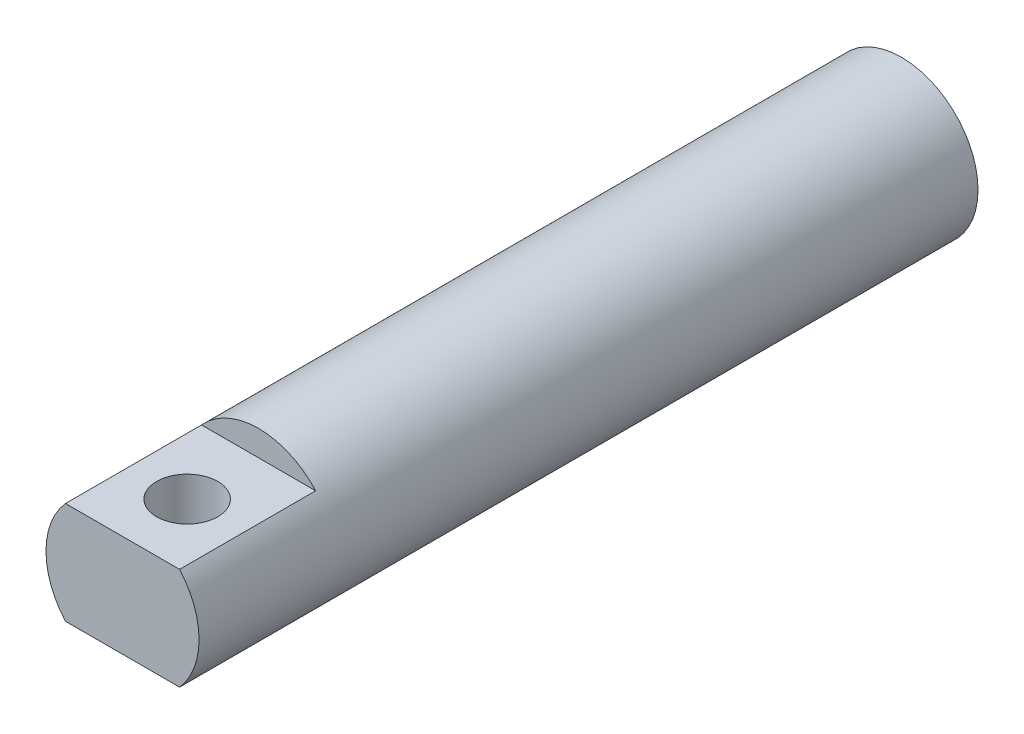
ISO-10303-21;
HEADER;
FILE_DESCRIPTION(('STEP AP214'),'2;1');
FILE_NAME('part.step','',(''),(''),'','','');
FILE_SCHEMA(('AUTOMOTIVE_DESIGN { 1 0 10303 214 1 1 1 1 }'));
ENDSEC;
DATA;
#1=APPLICATION_CONTEXT('core data for automotive mechanical design processes');
#2=APPLICATION_PROTOCOL_DEFINITION('international standard','automotive_design',2000,#1);
#3=PRODUCT_CONTEXT('',#1,'mechanical');
#4=PRODUCT('Part','Part','',(#3));
#5=PRODUCT_RELATED_PRODUCT_CATEGORY('part','',(#4));
#6=PRODUCT_DEFINITION_FORMATION('','',#4);
#7=PRODUCT_DEFINITION_CONTEXT('part definition',#1,'design');
#8=PRODUCT_DEFINITION('design','',#6,#7);
#9=PRODUCT_DEFINITION_SHAPE('','',#8);
#10=(LENGTH_UNIT() NAMED_UNIT(*) SI_UNIT(.MILLI.,.METRE.));
#11=(NAMED_UNIT(*) PLANE_ANGLE_UNIT() SI_UNIT($,.RADIAN.));
#12=(NAMED_UNIT(*) SI_UNIT($,.STERADIAN.) SOLID_ANGLE_UNIT());
#13=UNCERTAINTY_MEASURE_WITH_UNIT(LENGTH_MEASURE(1.E-05),#10,'distance_accuracy_value','');
#14=(GEOMETRIC_REPRESENTATION_CONTEXT(3) GLOBAL_UNCERTAINTY_ASSIGNED_CONTEXT((#13)) GLOBAL_UNIT_ASSIGNED_CONTEXT((#10,
#11,#12)) REPRESENTATION_CONTEXT('',''));
#15=CARTESIAN_POINT('',(0.,0.,0.));
#16=DIRECTION('',(0.,0.,1.));
#17=DIRECTION('',(1.,0.,0.));
#18=AXIS2_PLACEMENT_3D('',#15,#16,#17);
#19=CARTESIAN_POINT('',(0.,0.,37.8));
#20=DIRECTION('',(0.,0.,1.));
#21=DIRECTION('',(1.,0.,0.));
#22=AXIS2_PLACEMENT_3D('',#19,#20,#21);
#23=PLANE('',#22);
#24=CARTESIAN_POINT('',(0.,0.,37.8));
#25=DIRECTION('',(0.,0.,1.));
#26=DIRECTION('',(1.,0.,0.));
#27=AXIS2_PLACEMENT_3D('',#24,#25,#26);
#28=CIRCLE('',#27,4.5);
#29=CARTESIAN_POINT('',(3.35410196624968,3.,37.8));
#30=VERTEX_POINT('',#29);
#31=CARTESIAN_POINT('',(-3.35410196624968,3.,37.8));
#32=VERTEX_POINT('',#31);
#33=EDGE_CURVE('E11',#30,#32,#28,.T.);
#34=ORIENTED_EDGE('',*,*,#33,.T.);
#35=DIRECTION('',(1.,0.,0.));
#36=VECTOR('',#35,1.);
#37=CARTESIAN_POINT('',(0.,3.,37.8));
#38=LINE('',#37,#36);
#39=EDGE_CURVE('E63',#32,#30,#38,.T.);
#40=ORIENTED_EDGE('',*,*,#39,.T.);
#41=EDGE_LOOP('',(#34,#40));
#42=FACE_BOUND('',#41,.T.);
#43=ADVANCED_FACE('F17',(#42),#23,.T.);
#44=CARTESIAN_POINT('',(0.,0.,37.8));
#45=DIRECTION('',(0.,0.,-1.));
#46=DIRECTION('',(-1.,0.,0.));
#47=AXIS2_PLACEMENT_3D('',#44,#45,#46);
#48=CYLINDRICAL_SURFACE('',#47,4.5);
#49=ORIENTED_EDGE('',*,*,#33,.F.);
#50=DIRECTION('',(0.,0.,-1.));
#51=VECTOR('',#50,1.);
#52=CARTESIAN_POINT('',(3.35410196624968,3.,45.8));
#53=LINE('',#52,#51);
#54=CARTESIAN_POINT('',(3.35410196624968,3.,45.8));
#55=VERTEX_POINT('',#54);
#56=EDGE_CURVE('E87',#55,#30,#53,.T.);
#57=ORIENTED_EDGE('',*,*,#56,.F.);
#58=CARTESIAN_POINT('',(0.,0.,45.8));
#59=DIRECTION('',(0.,0.,1.));
#60=DIRECTION('',(1.,0.,0.));
#61=AXIS2_PLACEMENT_3D('',#58,#59,#60);
#62=CIRCLE('',#61,4.5);
#63=CARTESIAN_POINT('',(3.35410196624968,-3.,45.8));
#64=VERTEX_POINT('',#63);
#65=EDGE_CURVE('E75',#64,#55,#62,.T.);
#66=ORIENTED_EDGE('',*,*,#65,.F.);
#67=DIRECTION('',(0.,0.,-1.));
#68=VECTOR('',#67,1.);
#69=CARTESIAN_POINT('',(3.35410196624968,-3.,45.8));
#70=LINE('',#69,#68);
#71=CARTESIAN_POINT('',(3.35410196624968,-3.,37.8));
#72=VERTEX_POINT('',#71);
#73=EDGE_CURVE('E89',#64,#72,#70,.T.);
#74=ORIENTED_EDGE('',*,*,#73,.T.);
#75=CARTESIAN_POINT('',(-3.35410196624968,-3.,37.8));
#76=VERTEX_POINT('',#75);
#77=EDGE_CURVE('E26',#76,#72,#28,.T.);
#78=ORIENTED_EDGE('',*,*,#77,.F.);
#79=DIRECTION('',(0.,0.,-1.));
#80=VECTOR('',#79,1.);
#81=CARTESIAN_POINT('',(-3.35410196624968,-3.,45.8));
#82=LINE('',#81,#80);
#83=CARTESIAN_POINT('',(-3.35410196624968,-3.,45.8));
#84=VERTEX_POINT('',#83);
#85=EDGE_CURVE('E65',#84,#76,#82,.T.);
#86=ORIENTED_EDGE('',*,*,#85,.F.);
#87=CARTESIAN_POINT('',(-3.35410196624969,3.,45.8));
#88=VERTEX_POINT('',#87);
#89=EDGE_CURVE('E68',#88,#84,#62,.T.);
#90=ORIENTED_EDGE('',*,*,#89,.F.);
#91=DIRECTION('',(0.,0.,-1.));
#92=VECTOR('',#91,1.);
#93=CARTESIAN_POINT('',(-3.35410196624969,3.,45.8));
#94=LINE('',#93,#92);
#95=EDGE_CURVE('E57',#88,#32,#94,.T.);
#96=ORIENTED_EDGE('',*,*,#95,.T.);
#97=EDGE_LOOP('',(#49,#57,#66,#74,#78,#86,#90,#96));
#98=FACE_BOUND('',#97,.T.);
#99=CARTESIAN_POINT('',(0.,0.,0.));
#100=DIRECTION('',(0.,0.,1.));
#101=DIRECTION('',(1.,0.,0.));
#102=AXIS2_PLACEMENT_3D('',#99,#100,#101);
#103=CIRCLE('',#102,4.5);
#104=CARTESIAN_POINT('',(4.5,0.,0.));
#105=VERTEX_POINT('',#104);
#106=EDGE_CURVE('E21',#105,#105,#103,.T.);
#107=ORIENTED_EDGE('',*,*,#106,.T.);
#108=EDGE_LOOP('',(#107));
#109=FACE_BOUND('',#108,.T.);
#110=ADVANCED_FACE('F19',(#98,#109),#48,.T.);
#111=DIRECTION('',(1.,0.,0.));
#112=VECTOR('',#111,1.);
#113=CARTESIAN_POINT('',(0.,-3.,37.8));
#114=LINE('',#113,#112);
#115=EDGE_CURVE('E32',#76,#72,#114,.T.);
#116=ORIENTED_EDGE('',*,*,#115,.F.);
#117=ORIENTED_EDGE('',*,*,#77,.T.);
#118=EDGE_LOOP('',(#116,#117));
#119=FACE_BOUND('',#118,.T.);
#120=ADVANCED_FACE('F100',(#119),#23,.T.);
#121=CARTESIAN_POINT('',(0.,0.,0.));
#122=DIRECTION('',(0.,0.,1.));
#123=DIRECTION('',(1.,0.,0.));
#124=AXIS2_PLACEMENT_3D('',#121,#122,#123);
#125=PLANE('',#124);
#126=ORIENTED_EDGE('',*,*,#106,.F.);
#127=EDGE_LOOP('',(#126));
#128=FACE_BOUND('',#127,.T.);
#129=ADVANCED_FACE('F98',(#128),#125,.F.);
#130=CARTESIAN_POINT('',(0.,3.,45.8));
#131=DIRECTION('',(0.,1.,0.));
#132=DIRECTION('',(0.,0.,1.));
#133=AXIS2_PLACEMENT_3D('',#130,#131,#132);
#134=PLANE('',#133);
#135=CARTESIAN_POINT('',(0.,3.,42.));
#136=DIRECTION('',(0.,1.,0.));
#137=DIRECTION('',(0.,0.,1.));
#138=AXIS2_PLACEMENT_3D('',#135,#136,#137);
#139=CIRCLE('',#138,1.8);
#140=CARTESIAN_POINT('',(0.,3.,43.8));
#141=VERTEX_POINT('',#140);
#142=EDGE_CURVE('E82',#141,#141,#139,.T.);
#143=ORIENTED_EDGE('',*,*,#142,.F.);
#144=EDGE_LOOP('',(#143));
#145=FACE_BOUND('',#144,.T.);
#146=ORIENTED_EDGE('',*,*,#39,.F.);
#147=ORIENTED_EDGE('',*,*,#95,.F.);
#148=DIRECTION('',(1.,0.,0.));
#149=VECTOR('',#148,1.);
#150=CARTESIAN_POINT('',(0.,3.,45.8));
#151=LINE('',#150,#149);
#152=EDGE_CURVE('E62',#88,#55,#151,.T.);
#153=ORIENTED_EDGE('',*,*,#152,.T.);
#154=ORIENTED_EDGE('',*,*,#56,.T.);
#155=EDGE_LOOP('',(#146,#147,#153,#154));
#156=FACE_BOUND('',#155,.T.);
#157=ADVANCED_FACE('F59',(#145,#156),#134,.T.);
#158=CARTESIAN_POINT('',(0.,-3.,45.8));
#159=DIRECTION('',(0.,1.,0.));
#160=DIRECTION('',(0.,0.,1.));
#161=AXIS2_PLACEMENT_3D('',#158,#159,#160);
#162=PLANE('',#161);
#163=CARTESIAN_POINT('',(0.,-3.,42.));
#164=DIRECTION('',(0.,-1.,0.));
#165=DIRECTION('',(0.,0.,-1.));
#166=AXIS2_PLACEMENT_3D('',#163,#164,#165);
#167=CIRCLE('',#166,1.8);
#168=CARTESIAN_POINT('',(0.,-3.,40.2));
#169=VERTEX_POINT('',#168);
#170=EDGE_CURVE('E129',#169,#169,#167,.T.);
#171=ORIENTED_EDGE('',*,*,#170,.F.);
#172=EDGE_LOOP('',(#171));
#173=FACE_BOUND('',#172,.T.);
#174=ORIENTED_EDGE('',*,*,#115,.T.);
#175=ORIENTED_EDGE('',*,*,#73,.F.);
#176=DIRECTION('',(1.,0.,0.));
#177=VECTOR('',#176,1.);
#178=CARTESIAN_POINT('',(0.,-3.,45.8));
#179=LINE('',#178,#177);
#180=EDGE_CURVE('E73',#84,#64,#179,.T.);
#181=ORIENTED_EDGE('',*,*,#180,.F.);
#182=ORIENTED_EDGE('',*,*,#85,.T.);
#183=EDGE_LOOP('',(#174,#175,#181,#182));
#184=FACE_BOUND('',#183,.T.);
#185=ADVANCED_FACE('F93',(#173,#184),#162,.F.);
#186=CARTESIAN_POINT('',(0.,0.,45.8));
#187=DIRECTION('',(0.,0.,1.));
#188=DIRECTION('',(1.,0.,0.));
#189=AXIS2_PLACEMENT_3D('',#186,#187,#188);
#190=PLANE('',#189);
#191=ORIENTED_EDGE('',*,*,#152,.F.);
#192=ORIENTED_EDGE('',*,*,#89,.T.);
#193=ORIENTED_EDGE('',*,*,#180,.T.);
#194=ORIENTED_EDGE('',*,*,#65,.T.);
#195=EDGE_LOOP('',(#191,#192,#193,#194));
#196=FACE_BOUND('',#195,.T.);
#197=ADVANCED_FACE('F76',(#196),#190,.T.);
#198=CARTESIAN_POINT('',(0.,44.5456708167667,42.));
#199=DIRECTION('',(0.,-1.,0.));
#200=DIRECTION('',(0.,0.,-1.));
#201=AXIS2_PLACEMENT_3D('',#198,#199,#200);
#202=CYLINDRICAL_SURFACE('',#201,1.8);
#203=ORIENTED_EDGE('',*,*,#142,.T.);
#204=EDGE_LOOP('',(#203));
#205=FACE_BOUND('',#204,.T.);
#206=ORIENTED_EDGE('',*,*,#170,.T.);
#207=EDGE_LOOP('',(#206));
#208=FACE_BOUND('',#207,.T.);
#209=ADVANCED_FACE('F119',(#205,#208),#202,.F.);
#210=CLOSED_SHELL('',(#43,#110,#120,#129,#157,#185,#197,#209));
#211=MANIFOLD_SOLID_BREP('B1',#210);
#212=ADVANCED_BREP_SHAPE_REPRESENTATION('',(#18,#211),#14);
#213=SHAPE_DEFINITION_REPRESENTATION(#9,#212);
ENDSEC;
END-ISO-10303-21;
